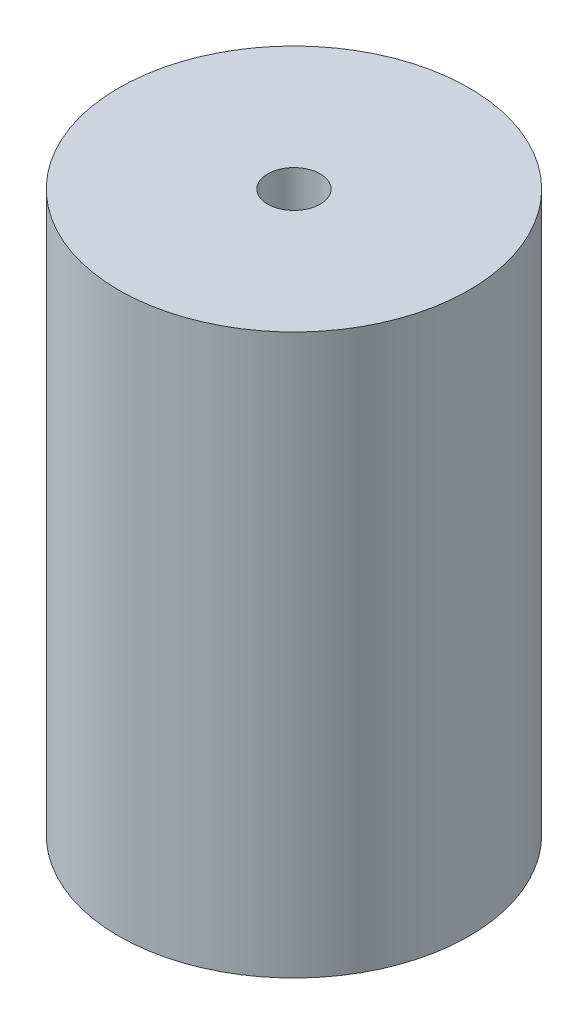
ISO-10303-21;
HEADER;
FILE_DESCRIPTION(('STEP AP214'),'2;1');
FILE_NAME('part.step','',(''),(''),'','','');
FILE_SCHEMA(('AUTOMOTIVE_DESIGN { 1 0 10303 214 1 1 1 1 }'));
ENDSEC;
DATA;
#1=APPLICATION_CONTEXT('core data for automotive mechanical design processes');
#2=APPLICATION_PROTOCOL_DEFINITION('international standard','automotive_design',2000,#1);
#3=PRODUCT_CONTEXT('',#1,'mechanical');
#4=PRODUCT('Part','Part','',(#3));
#5=PRODUCT_RELATED_PRODUCT_CATEGORY('part','',(#4));
#6=PRODUCT_DEFINITION_FORMATION('','',#4);
#7=PRODUCT_DEFINITION_CONTEXT('part definition',#1,'design');
#8=PRODUCT_DEFINITION('design','',#6,#7);
#9=PRODUCT_DEFINITION_SHAPE('','',#8);
#10=(LENGTH_UNIT() NAMED_UNIT(*) SI_UNIT(.MILLI.,.METRE.));
#11=(NAMED_UNIT(*) PLANE_ANGLE_UNIT() SI_UNIT($,.RADIAN.));
#12=(NAMED_UNIT(*) SI_UNIT($,.STERADIAN.) SOLID_ANGLE_UNIT());
#13=UNCERTAINTY_MEASURE_WITH_UNIT(LENGTH_MEASURE(1.E-05),#10,'distance_accuracy_value','');
#14=(GEOMETRIC_REPRESENTATION_CONTEXT(3) GLOBAL_UNCERTAINTY_ASSIGNED_CONTEXT((#13)) GLOBAL_UNIT_ASSIGNED_CONTEXT((#10,
#11,#12)) REPRESENTATION_CONTEXT('',''));
#15=CARTESIAN_POINT('',(0.,0.,0.));
#16=DIRECTION('',(0.,0.,1.));
#17=DIRECTION('',(1.,0.,0.));
#18=AXIS2_PLACEMENT_3D('',#15,#16,#17);
#19=CARTESIAN_POINT('',(0.,31.94,0.));
#20=DIRECTION('',(0.,1.,0.));
#21=DIRECTION('',(0.,0.,1.));
#22=AXIS2_PLACEMENT_3D('',#19,#20,#21);
#23=PLANE('',#22);
#24=CARTESIAN_POINT('',(0.,31.94,0.));
#25=DIRECTION('',(0.,1.,0.));
#26=DIRECTION('',(0.,0.,1.));
#27=AXIS2_PLACEMENT_3D('',#24,#25,#26);
#28=CIRCLE('',#27,10.);
#29=CARTESIAN_POINT('',(0.,31.94,10.));
#30=VERTEX_POINT('',#29);
#31=EDGE_CURVE('E10',#30,#30,#28,.T.);
#32=ORIENTED_EDGE('',*,*,#31,.T.);
#33=EDGE_LOOP('',(#32));
#34=FACE_BOUND('',#33,.T.);
#35=CARTESIAN_POINT('',(0.,31.94,0.));
#36=DIRECTION('',(0.,1.,0.));
#37=DIRECTION('',(0.,0.,1.));
#38=AXIS2_PLACEMENT_3D('',#35,#36,#37);
#39=CIRCLE('',#38,1.5);
#40=CARTESIAN_POINT('',(0.,31.94,1.5));
#41=VERTEX_POINT('',#40);
#42=EDGE_CURVE('E54',#41,#41,#39,.T.);
#43=ORIENTED_EDGE('',*,*,#42,.F.);
#44=EDGE_LOOP('',(#43));
#45=FACE_BOUND('',#44,.T.);
#46=ADVANCED_FACE('F41',(#34,#45),#23,.T.);
#47=CARTESIAN_POINT('',(0.,0.,0.));
#48=DIRECTION('',(0.,1.,0.));
#49=DIRECTION('',(0.,0.,1.));
#50=AXIS2_PLACEMENT_3D('',#47,#48,#49);
#51=PLANE('',#50);
#52=CARTESIAN_POINT('',(0.,0.,0.));
#53=DIRECTION('',(0.,1.,0.));
#54=DIRECTION('',(0.,0.,1.));
#55=AXIS2_PLACEMENT_3D('',#52,#53,#54);
#56=CIRCLE('',#55,10.);
#57=CARTESIAN_POINT('',(0.,0.,10.));
#58=VERTEX_POINT('',#57);
#59=EDGE_CURVE('E45',#58,#58,#56,.T.);
#60=ORIENTED_EDGE('',*,*,#59,.F.);
#61=EDGE_LOOP('',(#60));
#62=FACE_BOUND('',#61,.T.);
#63=CARTESIAN_POINT('',(0.,0.,0.));
#64=DIRECTION('',(0.,1.,0.));
#65=DIRECTION('',(0.,0.,1.));
#66=AXIS2_PLACEMENT_3D('',#63,#64,#65);
#67=CIRCLE('',#66,1.5);
#68=CARTESIAN_POINT('',(0.,0.,1.5));
#69=VERTEX_POINT('',#68);
#70=EDGE_CURVE('E56',#69,#69,#67,.T.);
#71=ORIENTED_EDGE('',*,*,#70,.T.);
#72=EDGE_LOOP('',(#71));
#73=FACE_BOUND('',#72,.T.);
#74=ADVANCED_FACE('F68',(#62,#73),#51,.F.);
#75=CARTESIAN_POINT('',(0.,31.94,0.));
#76=DIRECTION('',(0.,-1.,0.));
#77=DIRECTION('',(0.,0.,-1.));
#78=AXIS2_PLACEMENT_3D('',#75,#76,#77);
#79=CYLINDRICAL_SURFACE('',#78,10.);
#80=ORIENTED_EDGE('',*,*,#31,.F.);
#81=EDGE_LOOP('',(#80));
#82=FACE_BOUND('',#81,.T.);
#83=ORIENTED_EDGE('',*,*,#59,.T.);
#84=EDGE_LOOP('',(#83));
#85=FACE_BOUND('',#84,.T.);
#86=ADVANCED_FACE('F43',(#82,#85),#79,.T.);
#87=CARTESIAN_POINT('',(0.,31.94,0.));
#88=DIRECTION('',(0.,-1.,0.));
#89=DIRECTION('',(0.,0.,-1.));
#90=AXIS2_PLACEMENT_3D('',#87,#88,#89);
#91=CYLINDRICAL_SURFACE('',#90,1.5);
#92=ORIENTED_EDGE('',*,*,#42,.T.);
#93=EDGE_LOOP('',(#92));
#94=FACE_BOUND('',#93,.T.);
#95=ORIENTED_EDGE('',*,*,#70,.F.);
#96=EDGE_LOOP('',(#95));
#97=FACE_BOUND('',#96,.T.);
#98=ADVANCED_FACE('F64',(#94,#97),#91,.F.);
#99=CLOSED_SHELL('',(#46,#74,#86,#98));
#100=MANIFOLD_SOLID_BREP('B2',#99);
#101=ADVANCED_BREP_SHAPE_REPRESENTATION('',(#18,#100),#14);
#102=SHAPE_DEFINITION_REPRESENTATION(#9,#101);
ENDSEC;
END-ISO-10303-21;
